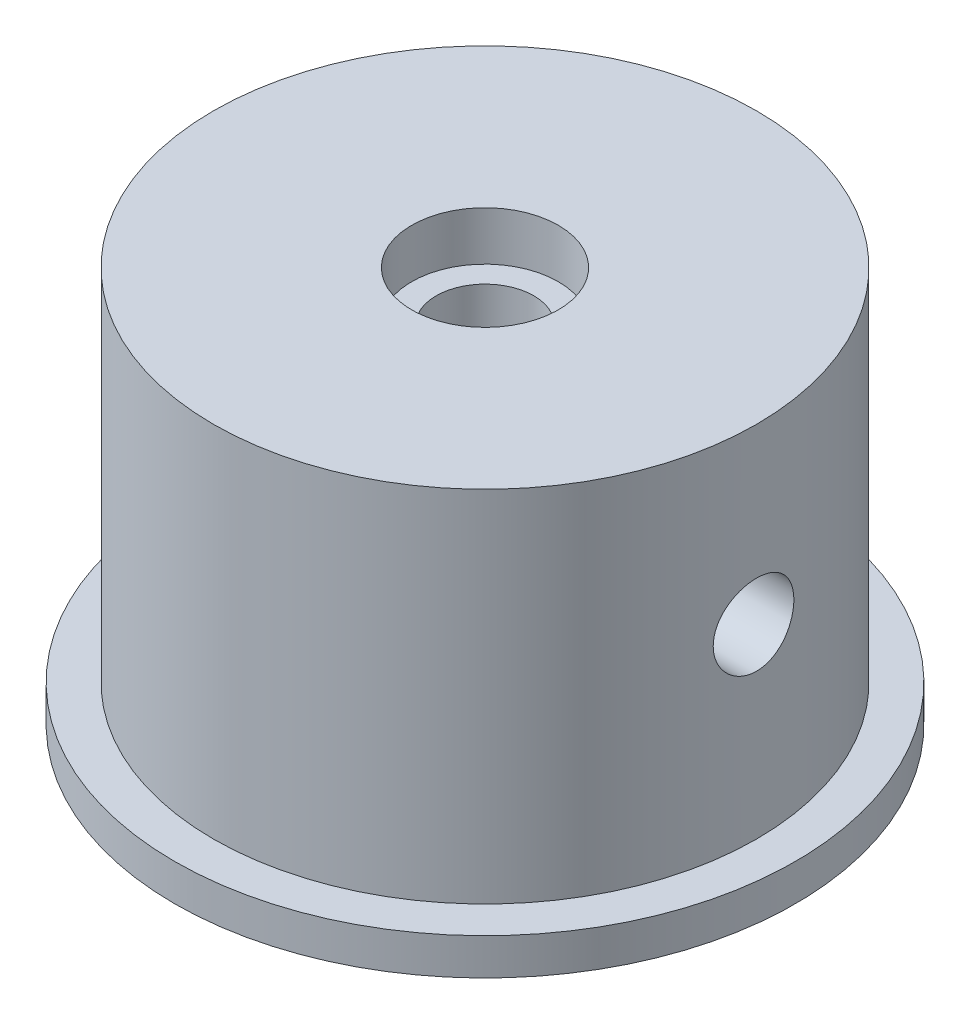
ISO-10303-21;
HEADER;
FILE_DESCRIPTION(('STEP AP214'),'2;1');
FILE_NAME('part.step','',(''),(''),'','','');
FILE_SCHEMA(('AUTOMOTIVE_DESIGN { 1 0 10303 214 1 1 1 1 }'));
ENDSEC;
DATA;
#1=APPLICATION_CONTEXT('core data for automotive mechanical design processes');
#2=APPLICATION_PROTOCOL_DEFINITION('international standard','automotive_design',2000,#1);
#3=PRODUCT_CONTEXT('',#1,'mechanical');
#4=PRODUCT('Part','Part','',(#3));
#5=PRODUCT_RELATED_PRODUCT_CATEGORY('part','',(#4));
#6=PRODUCT_DEFINITION_FORMATION('','',#4);
#7=PRODUCT_DEFINITION_CONTEXT('part definition',#1,'design');
#8=PRODUCT_DEFINITION('design','',#6,#7);
#9=PRODUCT_DEFINITION_SHAPE('','',#8);
#10=(LENGTH_UNIT() NAMED_UNIT(*) SI_UNIT(.MILLI.,.METRE.));
#11=(NAMED_UNIT(*) PLANE_ANGLE_UNIT() SI_UNIT($,.RADIAN.));
#12=(NAMED_UNIT(*) SI_UNIT($,.STERADIAN.) SOLID_ANGLE_UNIT());
#13=UNCERTAINTY_MEASURE_WITH_UNIT(LENGTH_MEASURE(1.E-05),#10,'distance_accuracy_value','');
#14=(GEOMETRIC_REPRESENTATION_CONTEXT(3) GLOBAL_UNCERTAINTY_ASSIGNED_CONTEXT((#13)) GLOBAL_UNIT_ASSIGNED_CONTEXT((#10,
#11,#12)) REPRESENTATION_CONTEXT('',''));
#15=CARTESIAN_POINT('',(0.,0.,0.));
#16=DIRECTION('',(0.,0.,1.));
#17=DIRECTION('',(1.,0.,0.));
#18=AXIS2_PLACEMENT_3D('',#15,#16,#17);
#19=CARTESIAN_POINT('',(0.,-1000.,-3.43024899888577E-12));
#20=DIRECTION('',(0.,-1.,0.));
#21=DIRECTION('',(0.,0.,-1.));
#22=AXIS2_PLACEMENT_3D('',#19,#20,#21);
#23=CYLINDRICAL_SURFACE('',#22,11.1125);
#24=CARTESIAN_POINT('',(-10.989320099533,7.1,-1.65));
#25=CARTESIAN_POINT('',(-10.9893216275905,7.00786853543191,-1.64999618659983));
#26=CARTESIAN_POINT('',(-10.9904912429801,6.91568331955536,-1.64225735815437));
#27=CARTESIAN_POINT('',(-10.9950402519829,6.73388950658974,-1.61151429191549));
#28=CARTESIAN_POINT('',(-10.9984218110616,6.6442835243784,-1.58849509450306));
#29=CARTESIAN_POINT('',(-11.0070034516113,6.47030595837421,-1.52789448606153));
#30=CARTESIAN_POINT('',(-11.0122021478141,6.38593044473396,-1.49032416552037));
#31=CARTESIAN_POINT('',(-11.0238306537277,6.22469338000084,-1.40171376180666));
#32=CARTESIAN_POINT('',(-11.0302602912365,6.14783078016165,-1.35067556233933));
#33=CARTESIAN_POINT('',(-11.0436826393442,6.00318608641397,-1.23615039373078));
#34=CARTESIAN_POINT('',(-11.050678984464,5.93547149546174,-1.17257858407139));
#35=CARTESIAN_POINT('',(-11.0644139812911,5.81162983574518,-1.03497393414701));
#36=CARTESIAN_POINT('',(-11.0711526189047,5.75550339998123,-0.960940522791249));
#37=CARTESIAN_POINT('',(-11.0836509156003,5.6561826313903,-0.80408225145624));
#38=CARTESIAN_POINT('',(-11.0894058187753,5.6130503948408,-0.721217661622787));
#39=CARTESIAN_POINT('',(-11.0992479888596,5.54134083309693,-0.549320495088192));
#40=CARTESIAN_POINT('',(-11.1033353421437,5.51276275401667,-0.460288238135409));
#41=CARTESIAN_POINT('',(-11.1093562405192,5.47117718534606,-0.279277956940888));
#42=CARTESIAN_POINT('',(-11.1113054080426,5.45805670351521,-0.187326419747734));
#43=CARTESIAN_POINT('',(-11.1128838468828,5.44740796680423,-0.00250761720228794));
#44=CARTESIAN_POINT('',(-11.1125132446891,5.44987886177706,0.0903595979453782));
#45=CARTESIAN_POINT('',(-11.10950639366,5.47025347900001,0.27360283626095));
#46=CARTESIAN_POINT('',(-11.1068879910719,5.48803564189437,0.363992709872134));
#47=CARTESIAN_POINT('',(-11.0996996332083,5.53833726696771,0.5404911686083));
#48=CARTESIAN_POINT('',(-11.0951296285293,5.57085710222213,0.626599645291013));
#49=CARTESIAN_POINT('',(-11.0845208720564,5.64983571390149,0.79245948776473));
#50=CARTESIAN_POINT('',(-11.0784767338956,5.69634575826496,0.872186082409831));
#51=CARTESIAN_POINT('',(-11.0655934970277,5.80194711694703,1.02274890645372));
#52=CARTESIAN_POINT('',(-11.0587543470438,5.86103924299148,1.09358456178972));
#53=CARTESIAN_POINT('',(-11.0449661840708,5.99080477622271,1.22507113980977));
#54=CARTESIAN_POINT('',(-11.0380167474928,6.06158430281294,1.2856173351551));
#55=CARTESIAN_POINT('',(-11.0248555976473,6.21235466200374,1.39398877185935));
#56=CARTESIAN_POINT('',(-11.0186438887511,6.29234554917988,1.441813937843));
#57=CARTESIAN_POINT('',(-11.007661638591,6.45937610270181,1.52339934791992));
#58=CARTESIAN_POINT('',(-11.002892185093,6.54642102685942,1.55714898332091));
#59=CARTESIAN_POINT('',(-10.9953538301128,6.72503025071899,1.60952076110758));
#60=CARTESIAN_POINT('',(-10.9925847906214,6.81659423818348,1.62814394708327));
#61=CARTESIAN_POINT('',(-10.9893868999923,7.00071109742415,1.64959087577128));
#62=CARTESIAN_POINT('',(-10.9889360709001,7.09324631583583,1.65256300592292));
#63=CARTESIAN_POINT('',(-10.9903673101815,7.27749353764112,1.64301704961528));
#64=CARTESIAN_POINT('',(-10.9922493076762,7.36920556596069,1.6304994337852));
#65=CARTESIAN_POINT('',(-10.9981139659201,7.54874431768594,1.590455107802));
#66=CARTESIAN_POINT('',(-11.0020862957919,7.63658786642525,1.56300218878138));
#67=CARTESIAN_POINT('',(-11.0116755269427,7.8064264449037,1.49394325102178));
#68=CARTESIAN_POINT('',(-11.017292507931,7.88842119093646,1.45233654629268));
#69=CARTESIAN_POINT('',(-11.0295899847129,8.04490021764516,1.35579403343358));
#70=CARTESIAN_POINT('',(-11.0362780260456,8.11932458105287,1.30076208726458));
#71=CARTESIAN_POINT('',(-11.0499412615485,8.25793457119731,1.17906504058943));
#72=CARTESIAN_POINT('',(-11.0569164716021,8.3221196306327,1.11239929594916));
#73=CARTESIAN_POINT('',(-11.0704367261392,8.43896117831891,0.968673898722707));
#74=CARTESIAN_POINT('',(-11.076977798716,8.49151938188479,0.891533916897155));
#75=CARTESIAN_POINT('',(-11.0888312104464,8.5829308311965,0.729433686899505));
#76=CARTESIAN_POINT('',(-11.0941435826598,8.62178444569576,0.644473649221542));
#77=CARTESIAN_POINT('',(-11.1029236158221,8.68452641810516,0.469453159725719));
#78=CARTESIAN_POINT('',(-11.1063979186819,8.70846871482533,0.379412391339469));
#79=CARTESIAN_POINT('',(-11.11113821481,8.74088304236688,0.196533055895866));
#80=CARTESIAN_POINT('',(-11.1124043508623,8.74935607345933,0.103694670132213));
#81=CARTESIAN_POINT('',(-11.1125842733386,8.75056731397848,-0.0811908889919396));
#82=CARTESIAN_POINT('',(-11.1115205533305,8.74345598209296,-0.173237090198544));
#83=CARTESIAN_POINT('',(-11.1072055977687,8.71402260988696,-0.354809520239036));
#84=CARTESIAN_POINT('',(-11.1039543688052,8.69170061539167,-0.444335756663981));
#85=CARTESIAN_POINT('',(-11.0956280108046,8.63253254458862,-0.618287019833986));
#86=CARTESIAN_POINT('',(-11.0905541642097,8.59569667886529,-0.702715584766822));
#87=CARTESIAN_POINT('',(-11.0791401600828,8.5085625087508,-0.864217269955667));
#88=CARTESIAN_POINT('',(-11.0727999631099,8.45826378503873,-0.941290161006728));
#89=CARTESIAN_POINT('',(-11.059485483991,8.34508679029519,-1.08665621186422));
#90=CARTESIAN_POINT('',(-11.0525059190431,8.28209736328974,-1.15486235337425));
#91=CARTESIAN_POINT('',(-11.0387386344333,8.14556080529887,-1.27979143802749));
#92=CARTESIAN_POINT('',(-11.0319509602008,8.07201119887086,-1.33651168119223));
#93=CARTESIAN_POINT('',(-11.0192959755854,7.91596714038504,-1.43713821454584));
#94=CARTESIAN_POINT('',(-11.013433931072,7.8334257284787,-1.48097233190514));
#95=CARTESIAN_POINT('',(-11.0033556548973,7.66210453263358,-1.55408967254406));
#96=CARTESIAN_POINT('',(-10.999137710819,7.57333135378715,-1.58338804429412));
#97=CARTESIAN_POINT('',(-10.9938029887798,7.42012945191087,-1.61992885217469));
#98=CARTESIAN_POINT('',(-10.9921307825552,7.35664837570988,-1.63118834761902));
#99=CARTESIAN_POINT('',(-10.9898888107439,7.22878694827512,-1.64622520746186));
#100=CARTESIAN_POINT('',(-10.9893190313094,7.16440660834752,-1.65000266584464));
#101=CARTESIAN_POINT('',(-10.989320099533,7.1,-1.65));
#102=B_SPLINE_CURVE_WITH_KNOTS('',3,(#24,#25,#26,#27,#28,#29,#30,#31,#32,#33,#34,#35,#36,#37,
#38,#39,#40,#41,#42,#43,#44,#45,#46,#47,#48,#49,#50,#51,#52,#53,#54,#55,#56,#57,#58,#59,#60,#61,
#62,#63,#64,#65,#66,#67,#68,#69,#70,#71,#72,#73,#74,#75,#76,#77,#78,#79,#80,#81,#82,#83,#84,#85,
#86,#87,#88,#89,#90,#91,#92,#93,#94,#95,#96,#97,#98,#99,#100,#101),.UNSPECIFIED.,.T.,.F.,(4,2,2,
2,2,2,2,2,2,2,2,2,2,2,2,2,2,2,2,2,2,2,2,2,2,2,2,2,2,2,2,2,2,2,2,2,2,2,4),(0.,0.276158988725957,
0.552588739118696,0.828808215239548,1.10498907796516,1.38310791439789,1.66124193899284,
1.94068475486997,2.22011309451008,2.49748593410564,2.7748436495937,3.05001945681757,
3.32520223034335,3.60140597360623,3.87762754139898,4.15651101907358,4.43539614916524,
4.71449109607343,4.9935667862852,5.26999173677526,5.5464082887763,5.82147138570116,
6.09654781598148,6.3736550748733,6.65077768136684,6.93016023642604,7.20953527348257,
7.48789376461151,7.76623425593243,8.04189936687315,8.31756364732053,8.5930343417737,
8.86851361717355,9.14651977224075,9.42459120226531,9.70419161751594,9.98350003105494,
10.1765577159361,10.3696129757423),.UNSPECIFIED.);
#103=CARTESIAN_POINT('',(-10.989320099533,7.1,-1.65));
#104=VERTEX_POINT('',#103);
#105=EDGE_CURVE('E72',#104,#104,#102,.T.);
#106=ORIENTED_EDGE('',*,*,#105,.F.);
#107=EDGE_LOOP('',(#106));
#108=FACE_BOUND('',#107,.T.);
#109=CARTESIAN_POINT('',(0.,-0.500000000000056,0.));
#110=DIRECTION('',(0.,-1.,0.));
#111=DIRECTION('',(0.,0.,-1.));
#112=AXIS2_PLACEMENT_3D('',#109,#110,#111);
#113=CIRCLE('',#112,11.1125);
#114=CARTESIAN_POINT('',(0.,-0.500000000000018,-11.1125));
#115=VERTEX_POINT('',#114);
#116=EDGE_CURVE('E57',#115,#115,#113,.T.);
#117=ORIENTED_EDGE('',*,*,#116,.F.);
#118=EDGE_LOOP('',(#117));
#119=FACE_BOUND('',#118,.T.);
#120=CARTESIAN_POINT('',(0.,14.2,0.));
#121=DIRECTION('',(0.,-1.,0.));
#122=DIRECTION('',(0.,0.,-1.));
#123=AXIS2_PLACEMENT_3D('',#120,#121,#122);
#124=CIRCLE('',#123,11.1125);
#125=CARTESIAN_POINT('',(0.,14.2,-11.1124999999999));
#126=VERTEX_POINT('',#125);
#127=EDGE_CURVE('E60',#126,#126,#124,.T.);
#128=ORIENTED_EDGE('',*,*,#127,.T.);
#129=EDGE_LOOP('',(#128));
#130=FACE_BOUND('',#129,.T.);
#131=CARTESIAN_POINT('',(10.989320099533,7.1,1.65));
#132=CARTESIAN_POINT('',(10.9893216275905,7.19213146456809,1.64999618659983));
#133=CARTESIAN_POINT('',(10.9904912429801,7.28431668044464,1.64225735815437));
#134=CARTESIAN_POINT('',(10.9950402519829,7.46611049341026,1.61151429191549));
#135=CARTESIAN_POINT('',(10.9984218110616,7.5557164756216,1.58849509450306));
#136=CARTESIAN_POINT('',(11.0070034516113,7.72969404162579,1.52789448606153));
#137=CARTESIAN_POINT('',(11.0122021478141,7.81406955526604,1.49032416552037));
#138=CARTESIAN_POINT('',(11.0238306537277,7.97530661999916,1.40171376180666));
#139=CARTESIAN_POINT('',(11.0302602912366,8.05216921983835,1.35067556233933));
#140=CARTESIAN_POINT('',(11.0436826393442,8.19681391358603,1.23615039373078));
#141=CARTESIAN_POINT('',(11.050678984464,8.26452850453826,1.17257858407139));
#142=CARTESIAN_POINT('',(11.0644139812911,8.38837016425482,1.03497393414701));
#143=CARTESIAN_POINT('',(11.0711526189047,8.44449660001877,0.960940522791249));
#144=CARTESIAN_POINT('',(11.0836509156003,8.5438173686097,0.80408225145624));
#145=CARTESIAN_POINT('',(11.0894058187753,8.5869496051592,0.721217661622787));
#146=CARTESIAN_POINT('',(11.0992479888596,8.65865916690307,0.549320495088192));
#147=CARTESIAN_POINT('',(11.1033353421437,8.68723724598333,0.460288238135409));
#148=CARTESIAN_POINT('',(11.1093562405192,8.72882281465394,0.279277956940888));
#149=CARTESIAN_POINT('',(11.1113054080426,8.74194329648479,0.187326419747735));
#150=CARTESIAN_POINT('',(11.1128838468828,8.75259203319578,0.00250761720228885));
#151=CARTESIAN_POINT('',(11.1125132446891,8.75012113822294,-0.0903595979453769));
#152=CARTESIAN_POINT('',(11.10950639366,8.729746521,-0.273602836260948));
#153=CARTESIAN_POINT('',(11.1068879910719,8.71196435810563,-0.363992709872133));
#154=CARTESIAN_POINT('',(11.0996996332083,8.6616627330323,-0.540491168608299));
#155=CARTESIAN_POINT('',(11.0951296285293,8.62914289777787,-0.626599645291012));
#156=CARTESIAN_POINT('',(11.0845208720564,8.55016428609851,-0.792459487764729));
#157=CARTESIAN_POINT('',(11.0784767338956,8.50365424173504,-0.87218608240983));
#158=CARTESIAN_POINT('',(11.0655934970277,8.39805288305298,-1.02274890645371));
#159=CARTESIAN_POINT('',(11.0587543470438,8.33896075700852,-1.09358456178972));
#160=CARTESIAN_POINT('',(11.0449661840708,8.20919522377729,-1.22507113980976));
#161=CARTESIAN_POINT('',(11.0380167474928,8.13841569718706,-1.2856173351551));
#162=CARTESIAN_POINT('',(11.0248555976473,7.98764533799626,-1.39398877185935));
#163=CARTESIAN_POINT('',(11.0186438887511,7.90765445082012,-1.441813937843));
#164=CARTESIAN_POINT('',(11.007661638591,7.74062389729819,-1.52339934791992));
#165=CARTESIAN_POINT('',(11.002892185093,7.65357897314058,-1.55714898332091));
#166=CARTESIAN_POINT('',(10.9953538301128,7.47496974928102,-1.60952076110758));
#167=CARTESIAN_POINT('',(10.9925847906214,7.38340576181652,-1.62814394708327));
#168=CARTESIAN_POINT('',(10.9893868999923,7.19928890257585,-1.64959087577128));
#169=CARTESIAN_POINT('',(10.9889360709001,7.10675368416418,-1.65256300592292));
#170=CARTESIAN_POINT('',(10.9903673101815,6.92250646235888,-1.64301704961528));
#171=CARTESIAN_POINT('',(10.9922493076762,6.83079443403931,-1.6304994337852));
#172=CARTESIAN_POINT('',(10.9981139659201,6.65125568231406,-1.590455107802));
#173=CARTESIAN_POINT('',(11.0020862957918,6.56341213357475,-1.56300218878138));
#174=CARTESIAN_POINT('',(11.0116755269427,6.3935735550963,-1.49394325102178));
#175=CARTESIAN_POINT('',(11.017292507931,6.31157880906354,-1.45233654629268));
#176=CARTESIAN_POINT('',(11.0295899847129,6.15509978235484,-1.35579403343359));
#177=CARTESIAN_POINT('',(11.0362780260456,6.08067541894713,-1.30076208726458));
#178=CARTESIAN_POINT('',(11.0499412615485,5.9420654288027,-1.17906504058943));
#179=CARTESIAN_POINT('',(11.0569164716021,5.8778803693673,-1.11239929594916));
#180=CARTESIAN_POINT('',(11.0704367261392,5.7610388216811,-0.968673898722708));
#181=CARTESIAN_POINT('',(11.076977798716,5.70848061811521,-0.891533916897156));
#182=CARTESIAN_POINT('',(11.0888312104464,5.6170691688035,-0.729433686899506));
#183=CARTESIAN_POINT('',(11.0941435826598,5.57821555430424,-0.644473649221542));
#184=CARTESIAN_POINT('',(11.1029236158221,5.51547358189484,-0.469453159725719));
#185=CARTESIAN_POINT('',(11.1063979186819,5.49153128517467,-0.37941239133947));
#186=CARTESIAN_POINT('',(11.11113821481,5.45911695763312,-0.196533055895866));
#187=CARTESIAN_POINT('',(11.1124043508623,5.45064392654066,-0.103694670132214));
#188=CARTESIAN_POINT('',(11.1125842733386,5.44943268602152,0.0811908889919385));
#189=CARTESIAN_POINT('',(11.1115205533306,5.45654401790704,0.173237090198543));
#190=CARTESIAN_POINT('',(11.1072055977687,5.48597739011304,0.354809520239034));
#191=CARTESIAN_POINT('',(11.1039543688052,5.50829938460833,0.44433575666398));
#192=CARTESIAN_POINT('',(11.0956280108046,5.56746745541138,0.618287019833985));
#193=CARTESIAN_POINT('',(11.0905541642097,5.60430332113471,0.702715584766822));
#194=CARTESIAN_POINT('',(11.0791401600828,5.6914374912492,0.864217269955667));
#195=CARTESIAN_POINT('',(11.07279996311,5.74173621496127,0.941290161006727));
#196=CARTESIAN_POINT('',(11.059485483991,5.85491320970481,1.08665621186422));
#197=CARTESIAN_POINT('',(11.0525059190431,5.91790263671026,1.15486235337424));
#198=CARTESIAN_POINT('',(11.0387386344333,6.05443919470113,1.27979143802749));
#199=CARTESIAN_POINT('',(11.0319509602008,6.12798880112914,1.33651168119222));
#200=CARTESIAN_POINT('',(11.0192959755854,6.28403285961496,1.43713821454584));
#201=CARTESIAN_POINT('',(11.013433931072,6.3665742715213,1.48097233190514));
#202=CARTESIAN_POINT('',(11.0033556548973,6.53789546736642,1.55408967254406));
#203=CARTESIAN_POINT('',(10.999137710819,6.62666864621285,1.58338804429412));
#204=CARTESIAN_POINT('',(10.9938029887798,6.77987054808912,1.61992885217469));
#205=CARTESIAN_POINT('',(10.9921307825552,6.84335162429012,1.63118834761902));
#206=CARTESIAN_POINT('',(10.9898888107439,6.97121305172488,1.64622520746186));
#207=CARTESIAN_POINT('',(10.9893190313094,7.03559339165248,1.65000266584464));
#208=CARTESIAN_POINT('',(10.989320099533,7.1,1.65));
#209=B_SPLINE_CURVE_WITH_KNOTS('',3,(#131,#132,#133,#134,#135,#136,#137,#138,#139,#140,#141,
#142,#143,#144,#145,#146,#147,#148,#149,#150,#151,#152,#153,#154,#155,#156,#157,#158,#159,#160,
#161,#162,#163,#164,#165,#166,#167,#168,#169,#170,#171,#172,#173,#174,#175,#176,#177,#178,#179,
#180,#181,#182,#183,#184,#185,#186,#187,#188,#189,#190,#191,#192,#193,#194,#195,#196,#197,#198,
#199,#200,#201,#202,#203,#204,#205,#206,#207,#208),.UNSPECIFIED.,.T.,.F.,(4,2,2,2,2,2,2,2,2,2,2,
2,2,2,2,2,2,2,2,2,2,2,2,2,2,2,2,2,2,2,2,2,2,2,2,2,2,2,4),(0.,0.276158988725957,
0.552588739118696,0.828808215239547,1.10498907796516,1.38310791439789,1.66124193899284,
1.94068475486997,2.22011309451008,2.49748593410564,2.7748436495937,3.05001945681757,
3.32520223034335,3.60140597360623,3.87762754139897,4.15651101907358,4.43539614916524,
4.71449109607343,4.9935667862852,5.26999173677526,5.5464082887763,5.82147138570116,
6.09654781598148,6.37365507487331,6.65077768136684,6.93016023642604,7.20953527348258,
7.48789376461151,7.76623425593243,8.04189936687315,8.31756364732053,8.59303434177371,
8.86851361717355,9.14651977224076,9.42459120226531,9.70419161751594,9.98350003105494,
10.1765577159361,10.3696129757423),.UNSPECIFIED.);
#210=CARTESIAN_POINT('',(10.989320099533,7.1,1.65));
#211=VERTEX_POINT('',#210);
#212=EDGE_CURVE('E206',#211,#211,#209,.T.);
#213=ORIENTED_EDGE('',*,*,#212,.T.);
#214=EDGE_LOOP('',(#213));
#215=FACE_BOUND('',#214,.T.);
#216=ADVANCED_FACE('F34',(#108,#119,#130,#215),#23,.T.);
#217=CARTESIAN_POINT('',(0.,-1000.,-3.43024899888577E-12));
#218=DIRECTION('',(0.,-1.,0.));
#219=DIRECTION('',(0.,0.,-1.));
#220=AXIS2_PLACEMENT_3D('',#217,#218,#219);
#221=CYLINDRICAL_SURFACE('',#220,1.99999999999998);
#222=CARTESIAN_POINT('',(0.,12.2,0.));
#223=DIRECTION('',(0.,-1.,0.));
#224=DIRECTION('',(0.,0.,-1.));
#225=AXIS2_PLACEMENT_3D('',#222,#223,#224);
#226=CIRCLE('',#225,1.99999999999996);
#227=CARTESIAN_POINT('',(0.,12.2,-1.99999999999992));
#228=VERTEX_POINT('',#227);
#229=EDGE_CURVE('E69',#228,#228,#226,.T.);
#230=ORIENTED_EDGE('',*,*,#229,.F.);
#231=EDGE_LOOP('',(#230));
#232=FACE_BOUND('',#231,.T.);
#233=CARTESIAN_POINT('',(0.,0.,0.));
#234=DIRECTION('',(0.,-1.,0.));
#235=DIRECTION('',(0.,0.,-1.));
#236=AXIS2_PLACEMENT_3D('',#233,#234,#235);
#237=CIRCLE('',#236,2.);
#238=CARTESIAN_POINT('',(0.,0.,-2.));
#239=VERTEX_POINT('',#238);
#240=EDGE_CURVE('E10',#239,#239,#237,.T.);
#241=ORIENTED_EDGE('',*,*,#240,.T.);
#242=EDGE_LOOP('',(#241));
#243=FACE_BOUND('',#242,.T.);
#244=ADVANCED_FACE('F36',(#232,#243),#221,.F.);
#245=CARTESIAN_POINT('',(0.,0.,2.));
#246=DIRECTION('',(0.,1.,0.));
#247=DIRECTION('',(0.,0.,1.));
#248=AXIS2_PLACEMENT_3D('',#245,#246,#247);
#249=PLANE('',#248);
#250=ORIENTED_EDGE('',*,*,#240,.F.);
#251=EDGE_LOOP('',(#250));
#252=FACE_BOUND('',#251,.T.);
#253=CARTESIAN_POINT('',(0.,0.,0.));
#254=DIRECTION('',(0.,-1.,0.));
#255=DIRECTION('',(0.,0.,-1.));
#256=AXIS2_PLACEMENT_3D('',#253,#254,#255);
#257=CIRCLE('',#256,3.);
#258=CARTESIAN_POINT('',(0.,0.,-3.));
#259=VERTEX_POINT('',#258);
#260=EDGE_CURVE('E41',#259,#259,#257,.T.);
#261=ORIENTED_EDGE('',*,*,#260,.T.);
#262=EDGE_LOOP('',(#261));
#263=FACE_BOUND('',#262,.T.);
#264=ADVANCED_FACE('F109',(#252,#263),#249,.F.);
#265=CARTESIAN_POINT('',(0.,-1000.,-3.43024899888577E-12));
#266=DIRECTION('',(0.,-1.,0.));
#267=DIRECTION('',(0.,0.,-1.));
#268=AXIS2_PLACEMENT_3D('',#265,#266,#267);
#269=CYLINDRICAL_SURFACE('',#268,3.);
#270=ORIENTED_EDGE('',*,*,#260,.F.);
#271=EDGE_LOOP('',(#270));
#272=FACE_BOUND('',#271,.T.);
#273=CARTESIAN_POINT('',(0.,-2.,0.));
#274=DIRECTION('',(0.,-1.,0.));
#275=DIRECTION('',(0.,0.,-1.));
#276=AXIS2_PLACEMENT_3D('',#273,#274,#275);
#277=CIRCLE('',#276,3.00000000000001);
#278=CARTESIAN_POINT('',(0.,-1.99999999999999,-3.00000000000001));
#279=VERTEX_POINT('',#278);
#280=EDGE_CURVE('E45',#279,#279,#277,.T.);
#281=ORIENTED_EDGE('',*,*,#280,.T.);
#282=EDGE_LOOP('',(#281));
#283=FACE_BOUND('',#282,.T.);
#284=ADVANCED_FACE('F128',(#272,#283),#269,.F.);
#285=CARTESIAN_POINT('',(0.,-1.99999999999998,3.));
#286=DIRECTION('',(0.,1.,0.));
#287=DIRECTION('',(0.,0.,1.));
#288=AXIS2_PLACEMENT_3D('',#285,#286,#287);
#289=PLANE('',#288);
#290=ORIENTED_EDGE('',*,*,#280,.F.);
#291=EDGE_LOOP('',(#290));
#292=FACE_BOUND('',#291,.T.);
#293=CARTESIAN_POINT('',(0.,-2.,0.));
#294=DIRECTION('',(0.,-1.,0.));
#295=DIRECTION('',(0.,0.,-1.));
#296=AXIS2_PLACEMENT_3D('',#293,#294,#295);
#297=CIRCLE('',#296,12.7);
#298=CARTESIAN_POINT('',(0.,-1.99999999999996,-12.7));
#299=VERTEX_POINT('',#298);
#300=EDGE_CURVE('E49',#299,#299,#297,.T.);
#301=ORIENTED_EDGE('',*,*,#300,.T.);
#302=EDGE_LOOP('',(#301));
#303=FACE_BOUND('',#302,.T.);
#304=ADVANCED_FACE('F124',(#292,#303),#289,.F.);
#305=CARTESIAN_POINT('',(0.,-1000.,-3.43024899888577E-12));
#306=DIRECTION('',(0.,-1.,0.));
#307=DIRECTION('',(0.,0.,-1.));
#308=AXIS2_PLACEMENT_3D('',#305,#306,#307);
#309=CYLINDRICAL_SURFACE('',#308,12.7);
#310=ORIENTED_EDGE('',*,*,#300,.F.);
#311=EDGE_LOOP('',(#310));
#312=FACE_BOUND('',#311,.T.);
#313=CARTESIAN_POINT('',(0.,-0.500000000000056,0.));
#314=DIRECTION('',(0.,-1.,0.));
#315=DIRECTION('',(0.,0.,-1.));
#316=AXIS2_PLACEMENT_3D('',#313,#314,#315);
#317=CIRCLE('',#316,12.7);
#318=CARTESIAN_POINT('',(0.,-0.500000000000012,-12.7));
#319=VERTEX_POINT('',#318);
#320=EDGE_CURVE('E54',#319,#319,#317,.T.);
#321=ORIENTED_EDGE('',*,*,#320,.T.);
#322=EDGE_LOOP('',(#321));
#323=FACE_BOUND('',#322,.T.);
#324=ADVANCED_FACE('F120',(#312,#323),#309,.T.);
#325=CARTESIAN_POINT('',(0.,-0.500000000000004,12.7));
#326=DIRECTION('',(0.,-1.,0.));
#327=DIRECTION('',(0.,0.,-1.));
#328=AXIS2_PLACEMENT_3D('',#325,#326,#327);
#329=PLANE('',#328);
#330=ORIENTED_EDGE('',*,*,#320,.F.);
#331=EDGE_LOOP('',(#330));
#332=FACE_BOUND('',#331,.T.);
#333=ORIENTED_EDGE('',*,*,#116,.T.);
#334=EDGE_LOOP('',(#333));
#335=FACE_BOUND('',#334,.T.);
#336=ADVANCED_FACE('F117',(#332,#335),#329,.F.);
#337=CARTESIAN_POINT('',(0.,14.2,11.1125));
#338=DIRECTION('',(0.,-1.,0.));
#339=DIRECTION('',(0.,0.,-1.));
#340=AXIS2_PLACEMENT_3D('',#337,#338,#339);
#341=PLANE('',#340);
#342=ORIENTED_EDGE('',*,*,#127,.F.);
#343=EDGE_LOOP('',(#342));
#344=FACE_BOUND('',#343,.T.);
#345=CARTESIAN_POINT('',(0.,14.2,0.));
#346=DIRECTION('',(0.,-1.,0.));
#347=DIRECTION('',(0.,0.,-1.));
#348=AXIS2_PLACEMENT_3D('',#345,#346,#347);
#349=CIRCLE('',#348,2.99999999999995);
#350=CARTESIAN_POINT('',(0.,14.2,-2.9999999999999));
#351=VERTEX_POINT('',#350);
#352=EDGE_CURVE('E63',#351,#351,#349,.T.);
#353=ORIENTED_EDGE('',*,*,#352,.T.);
#354=EDGE_LOOP('',(#353));
#355=FACE_BOUND('',#354,.T.);
#356=ADVANCED_FACE('F115',(#344,#355),#341,.F.);
#357=CARTESIAN_POINT('',(0.,-1000.,-3.43024899888577E-12));
#358=DIRECTION('',(0.,-1.,0.));
#359=DIRECTION('',(0.,0.,-1.));
#360=AXIS2_PLACEMENT_3D('',#357,#358,#359);
#361=CYLINDRICAL_SURFACE('',#360,2.99999999999996);
#362=ORIENTED_EDGE('',*,*,#352,.F.);
#363=EDGE_LOOP('',(#362));
#364=FACE_BOUND('',#363,.T.);
#365=CARTESIAN_POINT('',(0.,12.2,0.));
#366=DIRECTION('',(0.,-1.,0.));
#367=DIRECTION('',(0.,0.,-1.));
#368=AXIS2_PLACEMENT_3D('',#365,#366,#367);
#369=CIRCLE('',#368,2.99999999999996);
#370=CARTESIAN_POINT('',(0.,12.2,-2.99999999999992));
#371=VERTEX_POINT('',#370);
#372=EDGE_CURVE('E66',#371,#371,#369,.T.);
#373=ORIENTED_EDGE('',*,*,#372,.T.);
#374=EDGE_LOOP('',(#373));
#375=FACE_BOUND('',#374,.T.);
#376=ADVANCED_FACE('F160',(#364,#375),#361,.F.);
#377=CARTESIAN_POINT('',(0.,12.2,3.));
#378=DIRECTION('',(0.,-1.,0.));
#379=DIRECTION('',(0.,0.,-1.));
#380=AXIS2_PLACEMENT_3D('',#377,#378,#379);
#381=PLANE('',#380);
#382=ORIENTED_EDGE('',*,*,#372,.F.);
#383=EDGE_LOOP('',(#382));
#384=FACE_BOUND('',#383,.T.);
#385=ORIENTED_EDGE('',*,*,#229,.T.);
#386=EDGE_LOOP('',(#385));
#387=FACE_BOUND('',#386,.T.);
#388=ADVANCED_FACE('F100',(#384,#387),#381,.F.);
#389=CARTESIAN_POINT('',(-12.701,7.1,0.));
#390=DIRECTION('',(1.,0.,0.));
#391=DIRECTION('',(0.,0.,-1.));
#392=AXIS2_PLACEMENT_3D('',#389,#390,#391);
#393=CYLINDRICAL_SURFACE('',#392,1.65);
#394=CARTESIAN_POINT('',(-5.5,7.1,0.));
#395=DIRECTION('',(1.,0.,0.));
#396=DIRECTION('',(0.,0.,-1.));
#397=AXIS2_PLACEMENT_3D('',#394,#395,#396);
#398=CIRCLE('',#397,1.65);
#399=CARTESIAN_POINT('',(-5.5,7.1,-1.65));
#400=VERTEX_POINT('',#399);
#401=EDGE_CURVE('E80',#400,#400,#398,.T.);
#402=ORIENTED_EDGE('',*,*,#401,.T.);
#403=EDGE_LOOP('',(#402));
#404=FACE_BOUND('',#403,.T.);
#405=ORIENTED_EDGE('',*,*,#105,.T.);
#406=EDGE_LOOP('',(#405));
#407=FACE_BOUND('',#406,.T.);
#408=ADVANCED_FACE('F82',(#404,#407),#393,.F.);
#409=CARTESIAN_POINT('',(-5.5,7.1,0.));
#410=DIRECTION('',(1.,0.,0.));
#411=DIRECTION('',(0.,0.,-1.));
#412=AXIS2_PLACEMENT_3D('',#409,#410,#411);
#413=PLANE('',#412);
#414=ORIENTED_EDGE('',*,*,#401,.F.);
#415=EDGE_LOOP('',(#414));
#416=FACE_BOUND('',#415,.T.);
#417=ADVANCED_FACE('F91',(#416),#413,.F.);
#418=CARTESIAN_POINT('',(12.701,7.1,0.));
#419=DIRECTION('',(-1.,0.,0.));
#420=DIRECTION('',(0.,0.,1.));
#421=AXIS2_PLACEMENT_3D('',#418,#419,#420);
#422=CYLINDRICAL_SURFACE('',#421,1.65);
#423=CARTESIAN_POINT('',(5.5,7.1,0.));
#424=DIRECTION('',(1.,0.,0.));
#425=DIRECTION('',(0.,0.,-1.));
#426=AXIS2_PLACEMENT_3D('',#423,#424,#425);
#427=CIRCLE('',#426,1.65);
#428=CARTESIAN_POINT('',(5.5,7.1,-1.65));
#429=VERTEX_POINT('',#428);
#430=EDGE_CURVE('E212',#429,#429,#427,.T.);
#431=ORIENTED_EDGE('',*,*,#430,.F.);
#432=EDGE_LOOP('',(#431));
#433=FACE_BOUND('',#432,.T.);
#434=ORIENTED_EDGE('',*,*,#212,.F.);
#435=EDGE_LOOP('',(#434));
#436=FACE_BOUND('',#435,.T.);
#437=ADVANCED_FACE('F88',(#433,#436),#422,.F.);
#438=CARTESIAN_POINT('',(5.5,7.1,0.));
#439=DIRECTION('',(-1.,0.,0.));
#440=DIRECTION('',(0.,0.,-1.));
#441=AXIS2_PLACEMENT_3D('',#438,#439,#440);
#442=PLANE('',#441);
#443=ORIENTED_EDGE('',*,*,#430,.T.);
#444=EDGE_LOOP('',(#443));
#445=FACE_BOUND('',#444,.T.);
#446=ADVANCED_FACE('F98',(#445),#442,.F.);
#447=CLOSED_SHELL('',(#216,#244,#264,#284,#304,#324,#336,#356,#376,#388,#408,#417,#437,#446));
#448=MANIFOLD_SOLID_BREP('B2',#447);
#449=ADVANCED_BREP_SHAPE_REPRESENTATION('',(#18,#448),#14);
#450=SHAPE_DEFINITION_REPRESENTATION(#9,#449);
ENDSEC;
END-ISO-10303-21;
